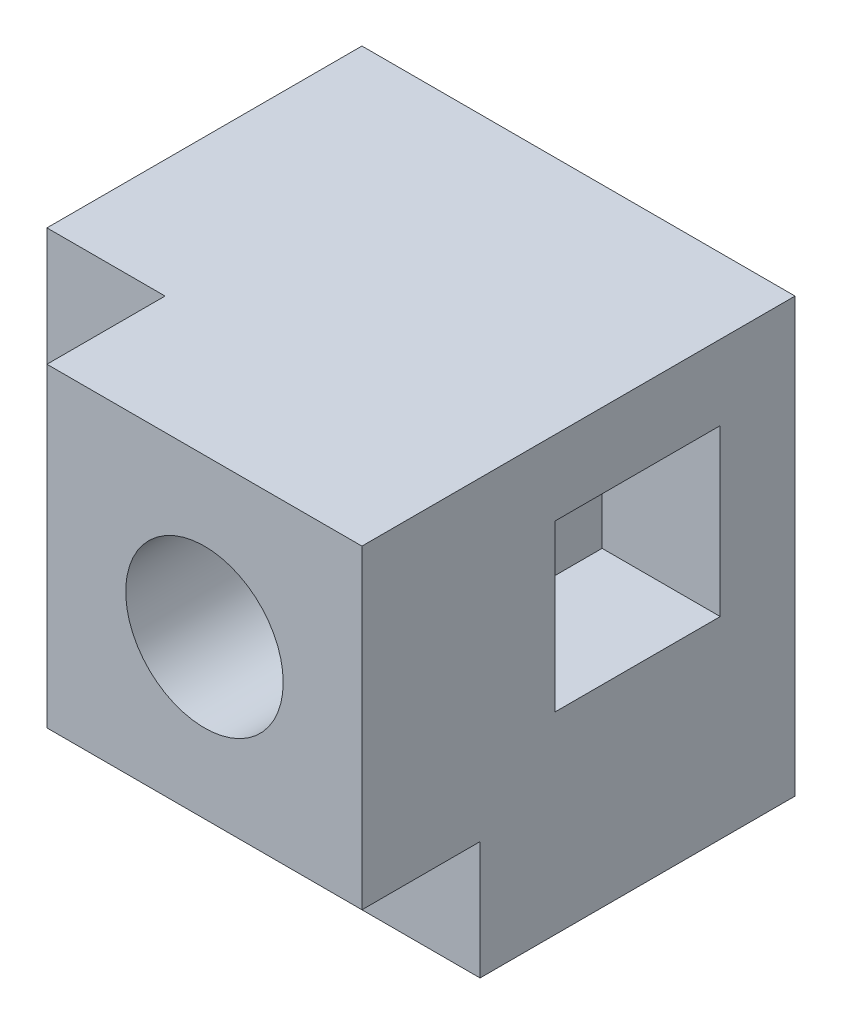
ISO-10303-21;
HEADER;
FILE_DESCRIPTION(('STEP AP214'),'2;1');
FILE_NAME('part.step','',(''),(''),'','','');
FILE_SCHEMA(('AUTOMOTIVE_DESIGN { 1 0 10303 214 1 1 1 1 }'));
ENDSEC;
DATA;
#1=APPLICATION_CONTEXT('core data for automotive mechanical design processes');
#2=APPLICATION_PROTOCOL_DEFINITION('international standard','automotive_design',2000,#1);
#3=PRODUCT_CONTEXT('',#1,'mechanical');
#4=PRODUCT('Part','Part','',(#3));
#5=PRODUCT_RELATED_PRODUCT_CATEGORY('part','',(#4));
#6=PRODUCT_DEFINITION_FORMATION('','',#4);
#7=PRODUCT_DEFINITION_CONTEXT('part definition',#1,'design');
#8=PRODUCT_DEFINITION('design','',#6,#7);
#9=PRODUCT_DEFINITION_SHAPE('','',#8);
#10=(LENGTH_UNIT() NAMED_UNIT(*) SI_UNIT(.MILLI.,.METRE.));
#11=(NAMED_UNIT(*) PLANE_ANGLE_UNIT() SI_UNIT($,.RADIAN.));
#12=(NAMED_UNIT(*) SI_UNIT($,.STERADIAN.) SOLID_ANGLE_UNIT());
#13=UNCERTAINTY_MEASURE_WITH_UNIT(LENGTH_MEASURE(1.E-05),#10,'distance_accuracy_value','');
#14=(GEOMETRIC_REPRESENTATION_CONTEXT(3) GLOBAL_UNCERTAINTY_ASSIGNED_CONTEXT((#13)) GLOBAL_UNIT_ASSIGNED_CONTEXT((#10,
#11,#12)) REPRESENTATION_CONTEXT('',''));
#15=CARTESIAN_POINT('',(0.,0.,0.));
#16=DIRECTION('',(0.,0.,1.));
#17=DIRECTION('',(1.,0.,0.));
#18=AXIS2_PLACEMENT_3D('',#15,#16,#17);
#19=CARTESIAN_POINT('',(0.,0.,0.));
#20=DIRECTION('',(0.,1.,0.));
#21=DIRECTION('',(0.,0.,1.));
#22=AXIS2_PLACEMENT_3D('',#19,#20,#21);
#23=PLANE('',#22);
#24=DIRECTION('',(0.,0.,-1.));
#25=VECTOR('',#24,1.);
#26=CARTESIAN_POINT('',(-40.,0.,40.));
#27=LINE('',#26,#25);
#28=CARTESIAN_POINT('',(-40.,0.,40.));
#29=VERTEX_POINT('',#28);
#30=CARTESIAN_POINT('',(-40.,0.,-40.));
#31=VERTEX_POINT('',#30);
#32=EDGE_CURVE('E181',#29,#31,#27,.T.);
#33=ORIENTED_EDGE('',*,*,#32,.F.);
#34=DIRECTION('',(1.,0.,0.));
#35=VECTOR('',#34,1.);
#36=CARTESIAN_POINT('',(-40.,0.,40.));
#37=LINE('',#36,#35);
#38=CARTESIAN_POINT('',(-70.,0.,40.));
#39=VERTEX_POINT('',#38);
#40=EDGE_CURVE('E242',#39,#29,#37,.T.);
#41=ORIENTED_EDGE('',*,*,#40,.F.);
#42=DIRECTION('',(0.,0.,1.));
#43=VECTOR('',#42,1.);
#44=CARTESIAN_POINT('',(-70.,0.,-40.));
#45=LINE('',#44,#43);
#46=CARTESIAN_POINT('',(-70.,0.,-40.));
#47=VERTEX_POINT('',#46);
#48=EDGE_CURVE('E228',#47,#39,#45,.T.);
#49=ORIENTED_EDGE('',*,*,#48,.F.);
#50=DIRECTION('',(-1.,0.,0.));
#51=VECTOR('',#50,1.);
#52=CARTESIAN_POINT('',(-40.,0.,-40.));
#53=LINE('',#52,#51);
#54=EDGE_CURVE('E58',#31,#47,#53,.T.);
#55=ORIENTED_EDGE('',*,*,#54,.F.);
#56=EDGE_LOOP('',(#33,#41,#49,#55));
#57=FACE_BOUND('',#56,.T.);
#58=ADVANCED_FACE('F35',(#57),#23,.F.);
#59=DIRECTION('',(-1.,0.,0.));
#60=VECTOR('',#59,1.);
#61=CARTESIAN_POINT('',(-40.,0.,40.));
#62=LINE('',#61,#60);
#63=CARTESIAN_POINT('',(40.,0.,40.));
#64=VERTEX_POINT('',#63);
#65=EDGE_CURVE('E188',#64,#29,#62,.T.);
#66=ORIENTED_EDGE('',*,*,#65,.F.);
#67=DIRECTION('',(0.,0.,-1.));
#68=VECTOR('',#67,1.);
#69=CARTESIAN_POINT('',(40.,0.,-40.));
#70=LINE('',#69,#68);
#71=CARTESIAN_POINT('',(40.,0.,70.));
#72=VERTEX_POINT('',#71);
#73=EDGE_CURVE('E237',#72,#64,#70,.T.);
#74=ORIENTED_EDGE('',*,*,#73,.F.);
#75=DIRECTION('',(1.,0.,0.));
#76=VECTOR('',#75,1.);
#77=CARTESIAN_POINT('',(40.,0.,70.));
#78=LINE('',#77,#76);
#79=CARTESIAN_POINT('',(-40.,0.,70.));
#80=VERTEX_POINT('',#79);
#81=EDGE_CURVE('E215',#80,#72,#78,.T.);
#82=ORIENTED_EDGE('',*,*,#81,.F.);
#83=DIRECTION('',(0.,0.,-1.));
#84=VECTOR('',#83,1.);
#85=CARTESIAN_POINT('',(-40.,0.,70.));
#86=LINE('',#85,#84);
#87=EDGE_CURVE('E218',#80,#29,#86,.T.);
#88=ORIENTED_EDGE('',*,*,#87,.T.);
#89=EDGE_LOOP('',(#66,#74,#82,#88));
#90=FACE_BOUND('',#89,.T.);
#91=ADVANCED_FACE('F269',(#90),#23,.F.);
#92=CARTESIAN_POINT('',(-40.,80.,40.));
#93=DIRECTION('',(0.,0.,-1.));
#94=DIRECTION('',(-1.,0.,0.));
#95=AXIS2_PLACEMENT_3D('',#92,#93,#94);
#96=PLANE('',#95);
#97=DIRECTION('',(0.,-1.,0.));
#98=VECTOR('',#97,1.);
#99=CARTESIAN_POINT('',(-40.,80.,40.));
#100=LINE('',#99,#98);
#101=CARTESIAN_POINT('',(-40.,80.,40.));
#102=VERTEX_POINT('',#101);
#103=EDGE_CURVE('E207',#102,#29,#100,.T.);
#104=ORIENTED_EDGE('',*,*,#103,.F.);
#105=DIRECTION('',(1.,0.,0.));
#106=VECTOR('',#105,1.);
#107=CARTESIAN_POINT('',(-40.,80.,40.));
#108=LINE('',#107,#106);
#109=CARTESIAN_POINT('',(-70.,80.,40.));
#110=VERTEX_POINT('',#109);
#111=EDGE_CURVE('E43',#110,#102,#108,.T.);
#112=ORIENTED_EDGE('',*,*,#111,.F.);
#113=DIRECTION('',(0.,1.,0.));
#114=VECTOR('',#113,1.);
#115=CARTESIAN_POINT('',(-70.,80.,40.));
#116=LINE('',#115,#114);
#117=EDGE_CURVE('E231',#39,#110,#116,.T.);
#118=ORIENTED_EDGE('',*,*,#117,.F.);
#119=ORIENTED_EDGE('',*,*,#40,.T.);
#120=EDGE_LOOP('',(#104,#112,#118,#119));
#121=FACE_BOUND('',#120,.T.);
#122=ADVANCED_FACE('F251',(#121),#96,.F.);
#123=CARTESIAN_POINT('',(40.,80.,-40.));
#124=DIRECTION('',(-1.,0.,0.));
#125=DIRECTION('',(0.,0.,1.));
#126=AXIS2_PLACEMENT_3D('',#123,#124,#125);
#127=PLANE('',#126);
#128=DIRECTION('',(0.,0.,-1.));
#129=VECTOR('',#128,1.);
#130=CARTESIAN_POINT('',(40.,19.,-21.));
#131=LINE('',#130,#129);
#132=CARTESIAN_POINT('',(40.,19.,21.));
#133=VERTEX_POINT('',#132);
#134=CARTESIAN_POINT('',(40.,19.,-21.));
#135=VERTEX_POINT('',#134);
#136=EDGE_CURVE('E156',#133,#135,#131,.T.);
#137=ORIENTED_EDGE('',*,*,#136,.F.);
#138=DIRECTION('',(0.,-1.,0.));
#139=VECTOR('',#138,1.);
#140=CARTESIAN_POINT('',(40.,19.,21.));
#141=LINE('',#140,#139);
#142=CARTESIAN_POINT('',(40.,61.,21.));
#143=VERTEX_POINT('',#142);
#144=EDGE_CURVE('E50',#143,#133,#141,.T.);
#145=ORIENTED_EDGE('',*,*,#144,.F.);
#146=DIRECTION('',(0.,0.,1.));
#147=VECTOR('',#146,1.);
#148=CARTESIAN_POINT('',(40.,61.,-21.));
#149=LINE('',#148,#147);
#150=CARTESIAN_POINT('',(40.,61.,-21.));
#151=VERTEX_POINT('',#150);
#152=EDGE_CURVE('E147',#151,#143,#149,.T.);
#153=ORIENTED_EDGE('',*,*,#152,.F.);
#154=DIRECTION('',(0.,1.,0.));
#155=VECTOR('',#154,1.);
#156=CARTESIAN_POINT('',(40.,19.,-21.));
#157=LINE('',#156,#155);
#158=EDGE_CURVE('E150',#135,#151,#157,.T.);
#159=ORIENTED_EDGE('',*,*,#158,.F.);
#160=EDGE_LOOP('',(#137,#145,#153,#159));
#161=FACE_BOUND('',#160,.T.);
#162=ORIENTED_EDGE('',*,*,#73,.T.);
#163=DIRECTION('',(0.,1.,0.));
#164=VECTOR('',#163,1.);
#165=CARTESIAN_POINT('',(40.,-30.,40.));
#166=LINE('',#165,#164);
#167=CARTESIAN_POINT('',(40.,-30.,40.));
#168=VERTEX_POINT('',#167);
#169=EDGE_CURVE('E202',#168,#64,#166,.T.);
#170=ORIENTED_EDGE('',*,*,#169,.F.);
#171=DIRECTION('',(0.,0.,1.));
#172=VECTOR('',#171,1.);
#173=CARTESIAN_POINT('',(40.,-30.,40.));
#174=LINE('',#173,#172);
#175=CARTESIAN_POINT('',(40.,-30.,-40.));
#176=VERTEX_POINT('',#175);
#177=EDGE_CURVE('E191',#176,#168,#174,.T.);
#178=ORIENTED_EDGE('',*,*,#177,.F.);
#179=DIRECTION('',(0.,-1.,0.));
#180=VECTOR('',#179,1.);
#181=CARTESIAN_POINT('',(40.,80.,-40.));
#182=LINE('',#181,#180);
#183=CARTESIAN_POINT('',(40.,80.,-40.));
#184=VERTEX_POINT('',#183);
#185=EDGE_CURVE('E11',#184,#176,#182,.T.);
#186=ORIENTED_EDGE('',*,*,#185,.F.);
#187=DIRECTION('',(0.,0.,-1.));
#188=VECTOR('',#187,1.);
#189=CARTESIAN_POINT('',(40.,80.,-40.));
#190=LINE('',#189,#188);
#191=CARTESIAN_POINT('',(40.,80.,70.));
#192=VERTEX_POINT('',#191);
#193=EDGE_CURVE('E238',#192,#184,#190,.T.);
#194=ORIENTED_EDGE('',*,*,#193,.F.);
#195=DIRECTION('',(0.,1.,0.));
#196=VECTOR('',#195,1.);
#197=CARTESIAN_POINT('',(40.,80.,70.));
#198=LINE('',#197,#196);
#199=EDGE_CURVE('E208',#72,#192,#198,.T.);
#200=ORIENTED_EDGE('',*,*,#199,.F.);
#201=EDGE_LOOP('',(#162,#170,#178,#186,#194,#200));
#202=FACE_BOUND('',#201,.T.);
#203=ADVANCED_FACE('F37',(#161,#202),#127,.F.);
#204=CARTESIAN_POINT('',(-40.,80.,-40.));
#205=DIRECTION('',(0.,0.,1.));
#206=DIRECTION('',(1.,0.,0.));
#207=AXIS2_PLACEMENT_3D('',#204,#205,#206);
#208=PLANE('',#207);
#209=ORIENTED_EDGE('',*,*,#185,.T.);
#210=DIRECTION('',(1.,0.,0.));
#211=VECTOR('',#210,1.);
#212=CARTESIAN_POINT('',(-40.,-30.,-40.));
#213=LINE('',#212,#211);
#214=CARTESIAN_POINT('',(-40.,-30.,-40.));
#215=VERTEX_POINT('',#214);
#216=EDGE_CURVE('E187',#215,#176,#213,.T.);
#217=ORIENTED_EDGE('',*,*,#216,.F.);
#218=DIRECTION('',(0.,1.,0.));
#219=VECTOR('',#218,1.);
#220=CARTESIAN_POINT('',(-40.,-30.,-40.));
#221=LINE('',#220,#219);
#222=EDGE_CURVE('E205',#215,#31,#221,.T.);
#223=ORIENTED_EDGE('',*,*,#222,.T.);
#224=ORIENTED_EDGE('',*,*,#54,.T.);
#225=DIRECTION('',(0.,-1.,0.));
#226=VECTOR('',#225,1.);
#227=CARTESIAN_POINT('',(-70.,80.,-40.));
#228=LINE('',#227,#226);
#229=CARTESIAN_POINT('',(-70.,80.,-40.));
#230=VERTEX_POINT('',#229);
#231=EDGE_CURVE('E225',#230,#47,#228,.T.);
#232=ORIENTED_EDGE('',*,*,#231,.F.);
#233=DIRECTION('',(-1.,0.,0.));
#234=VECTOR('',#233,1.);
#235=CARTESIAN_POINT('',(-40.,80.,-40.));
#236=LINE('',#235,#234);
#237=EDGE_CURVE('E241',#184,#230,#236,.T.);
#238=ORIENTED_EDGE('',*,*,#237,.F.);
#239=EDGE_LOOP('',(#209,#217,#223,#224,#232,#238));
#240=FACE_BOUND('',#239,.T.);
#241=ADVANCED_FACE('F285',(#240),#208,.F.);
#242=CARTESIAN_POINT('',(0.,80.,0.));
#243=DIRECTION('',(0.,1.,0.));
#244=DIRECTION('',(0.,0.,1.));
#245=AXIS2_PLACEMENT_3D('',#242,#243,#244);
#246=PLANE('',#245);
#247=ORIENTED_EDGE('',*,*,#193,.T.);
#248=ORIENTED_EDGE('',*,*,#237,.T.);
#249=DIRECTION('',(0.,0.,-1.));
#250=VECTOR('',#249,1.);
#251=CARTESIAN_POINT('',(-70.,80.,-40.));
#252=LINE('',#251,#250);
#253=EDGE_CURVE('E234',#110,#230,#252,.T.);
#254=ORIENTED_EDGE('',*,*,#253,.F.);
#255=ORIENTED_EDGE('',*,*,#111,.T.);
#256=DIRECTION('',(0.,0.,-1.));
#257=VECTOR('',#256,1.);
#258=CARTESIAN_POINT('',(-40.,80.,70.));
#259=LINE('',#258,#257);
#260=CARTESIAN_POINT('',(-40.,80.,70.));
#261=VERTEX_POINT('',#260);
#262=EDGE_CURVE('E222',#261,#102,#259,.T.);
#263=ORIENTED_EDGE('',*,*,#262,.F.);
#264=DIRECTION('',(-1.,0.,0.));
#265=VECTOR('',#264,1.);
#266=CARTESIAN_POINT('',(40.,80.,70.));
#267=LINE('',#266,#265);
#268=EDGE_CURVE('E211',#192,#261,#267,.T.);
#269=ORIENTED_EDGE('',*,*,#268,.F.);
#270=EDGE_LOOP('',(#247,#248,#254,#255,#263,#269));
#271=FACE_BOUND('',#270,.T.);
#272=ADVANCED_FACE('F279',(#271),#246,.T.);
#273=CARTESIAN_POINT('',(-70.,0.,0.));
#274=DIRECTION('',(-1.,0.,0.));
#275=DIRECTION('',(0.,0.,1.));
#276=AXIS2_PLACEMENT_3D('',#273,#274,#275);
#277=PLANE('',#276);
#278=CARTESIAN_POINT('',(-70.,40.,0.));
#279=DIRECTION('',(-1.,0.,0.));
#280=DIRECTION('',(0.,0.,1.));
#281=AXIS2_PLACEMENT_3D('',#278,#279,#280);
#282=CIRCLE('',#281,20.);
#283=CARTESIAN_POINT('',(-70.,40.,20.));
#284=VERTEX_POINT('',#283);
#285=EDGE_CURVE('E175',#284,#284,#282,.T.);
#286=ORIENTED_EDGE('',*,*,#285,.F.);
#287=EDGE_LOOP('',(#286));
#288=FACE_BOUND('',#287,.T.);
#289=ORIENTED_EDGE('',*,*,#231,.T.);
#290=ORIENTED_EDGE('',*,*,#48,.T.);
#291=ORIENTED_EDGE('',*,*,#117,.T.);
#292=ORIENTED_EDGE('',*,*,#253,.T.);
#293=EDGE_LOOP('',(#289,#290,#291,#292));
#294=FACE_BOUND('',#293,.T.);
#295=ADVANCED_FACE('F282',(#288,#294),#277,.T.);
#296=CARTESIAN_POINT('',(-40.,80.,70.));
#297=DIRECTION('',(1.,0.,0.));
#298=DIRECTION('',(0.,0.,-1.));
#299=AXIS2_PLACEMENT_3D('',#296,#297,#298);
#300=PLANE('',#299);
#301=ORIENTED_EDGE('',*,*,#103,.T.);
#302=ORIENTED_EDGE('',*,*,#87,.F.);
#303=DIRECTION('',(0.,-1.,0.));
#304=VECTOR('',#303,1.);
#305=CARTESIAN_POINT('',(-40.,80.,70.));
#306=LINE('',#305,#304);
#307=EDGE_CURVE('E213',#261,#80,#306,.T.);
#308=ORIENTED_EDGE('',*,*,#307,.F.);
#309=ORIENTED_EDGE('',*,*,#262,.T.);
#310=EDGE_LOOP('',(#301,#302,#308,#309));
#311=FACE_BOUND('',#310,.T.);
#312=ADVANCED_FACE('F277',(#311),#300,.F.);
#313=CARTESIAN_POINT('',(0.,0.,70.));
#314=DIRECTION('',(0.,0.,-1.));
#315=DIRECTION('',(-1.,0.,0.));
#316=AXIS2_PLACEMENT_3D('',#313,#314,#315);
#317=PLANE('',#316);
#318=CARTESIAN_POINT('',(0.,40.,70.));
#319=DIRECTION('',(0.,0.,1.));
#320=DIRECTION('',(1.,0.,0.));
#321=AXIS2_PLACEMENT_3D('',#318,#319,#320);
#322=CIRCLE('',#321,20.);
#323=CARTESIAN_POINT('',(20.,40.,70.));
#324=VERTEX_POINT('',#323);
#325=EDGE_CURVE('E169',#324,#324,#322,.T.);
#326=ORIENTED_EDGE('',*,*,#325,.F.);
#327=EDGE_LOOP('',(#326));
#328=FACE_BOUND('',#327,.T.);
#329=ORIENTED_EDGE('',*,*,#199,.T.);
#330=ORIENTED_EDGE('',*,*,#268,.T.);
#331=ORIENTED_EDGE('',*,*,#307,.T.);
#332=ORIENTED_EDGE('',*,*,#81,.T.);
#333=EDGE_LOOP('',(#329,#330,#331,#332));
#334=FACE_BOUND('',#333,.T.);
#335=ADVANCED_FACE('F271',(#328,#334),#317,.F.);
#336=CARTESIAN_POINT('',(-40.,-30.,40.));
#337=DIRECTION('',(1.,0.,0.));
#338=DIRECTION('',(0.,0.,-1.));
#339=AXIS2_PLACEMENT_3D('',#336,#337,#338);
#340=PLANE('',#339);
#341=ORIENTED_EDGE('',*,*,#32,.T.);
#342=ORIENTED_EDGE('',*,*,#222,.F.);
#343=DIRECTION('',(0.,0.,-1.));
#344=VECTOR('',#343,1.);
#345=CARTESIAN_POINT('',(-40.,-30.,40.));
#346=LINE('',#345,#344);
#347=CARTESIAN_POINT('',(-40.,-30.,40.));
#348=VERTEX_POINT('',#347);
#349=EDGE_CURVE('E184',#348,#215,#346,.T.);
#350=ORIENTED_EDGE('',*,*,#349,.F.);
#351=DIRECTION('',(0.,1.,0.));
#352=VECTOR('',#351,1.);
#353=CARTESIAN_POINT('',(-40.,-30.,40.));
#354=LINE('',#353,#352);
#355=EDGE_CURVE('E195',#348,#29,#354,.T.);
#356=ORIENTED_EDGE('',*,*,#355,.T.);
#357=EDGE_LOOP('',(#341,#342,#350,#356));
#358=FACE_BOUND('',#357,.T.);
#359=ADVANCED_FACE('F261',(#358),#340,.F.);
#360=CARTESIAN_POINT('',(-40.,-30.,40.));
#361=DIRECTION('',(0.,0.,-1.));
#362=DIRECTION('',(-1.,0.,0.));
#363=AXIS2_PLACEMENT_3D('',#360,#361,#362);
#364=PLANE('',#363);
#365=ORIENTED_EDGE('',*,*,#65,.T.);
#366=ORIENTED_EDGE('',*,*,#355,.F.);
#367=DIRECTION('',(-1.,0.,0.));
#368=VECTOR('',#367,1.);
#369=CARTESIAN_POINT('',(-40.,-30.,40.));
#370=LINE('',#369,#368);
#371=EDGE_CURVE('E193',#168,#348,#370,.T.);
#372=ORIENTED_EDGE('',*,*,#371,.F.);
#373=ORIENTED_EDGE('',*,*,#169,.T.);
#374=EDGE_LOOP('',(#365,#366,#372,#373));
#375=FACE_BOUND('',#374,.T.);
#376=ADVANCED_FACE('F256',(#375),#364,.F.);
#377=CARTESIAN_POINT('',(0.,-30.,0.));
#378=DIRECTION('',(0.,-1.,0.));
#379=DIRECTION('',(0.,0.,-1.));
#380=AXIS2_PLACEMENT_3D('',#377,#378,#379);
#381=PLANE('',#380);
#382=CARTESIAN_POINT('',(0.,-30.,0.));
#383=DIRECTION('',(0.,-1.,0.));
#384=DIRECTION('',(0.,0.,-1.));
#385=AXIS2_PLACEMENT_3D('',#382,#383,#384);
#386=CIRCLE('',#385,20.);
#387=CARTESIAN_POINT('',(0.,-30.,-20.));
#388=VERTEX_POINT('',#387);
#389=EDGE_CURVE('E162',#388,#388,#386,.T.);
#390=ORIENTED_EDGE('',*,*,#389,.F.);
#391=EDGE_LOOP('',(#390));
#392=FACE_BOUND('',#391,.T.);
#393=ORIENTED_EDGE('',*,*,#349,.T.);
#394=ORIENTED_EDGE('',*,*,#216,.T.);
#395=ORIENTED_EDGE('',*,*,#177,.T.);
#396=ORIENTED_EDGE('',*,*,#371,.T.);
#397=EDGE_LOOP('',(#393,#394,#395,#396));
#398=FACE_BOUND('',#397,.T.);
#399=ADVANCED_FACE('F263',(#392,#398),#381,.T.);
#400=CARTESIAN_POINT('',(-25.,40.,0.));
#401=DIRECTION('',(-1.,0.,0.));
#402=DIRECTION('',(0.,0.,1.));
#403=AXIS2_PLACEMENT_3D('',#400,#401,#402);
#404=CYLINDRICAL_SURFACE('',#403,20.);
#405=CARTESIAN_POINT('',(-25.,40.,0.));
#406=DIRECTION('',(-1.,0.,0.));
#407=DIRECTION('',(0.,0.,1.));
#408=AXIS2_PLACEMENT_3D('',#405,#406,#407);
#409=CIRCLE('',#408,20.);
#410=CARTESIAN_POINT('',(-25.,40.,20.));
#411=VERTEX_POINT('',#410);
#412=EDGE_CURVE('E178',#411,#411,#409,.T.);
#413=CARTESIAN_POINT('',(-25.,40.,20.));
#414=CARTESIAN_POINT('',(-25.46875,40.,20.));
#415=CARTESIAN_POINT('',(-25.9375,40.,20.));
#416=CARTESIAN_POINT('',(-26.875,40.,20.));
#417=CARTESIAN_POINT('',(-27.34375,40.,20.));
#418=CARTESIAN_POINT('',(-28.28125,40.,20.));
#419=CARTESIAN_POINT('',(-28.75,40.,20.));
#420=CARTESIAN_POINT('',(-29.6875,40.,20.));
#421=CARTESIAN_POINT('',(-30.15625,40.,20.));
#422=CARTESIAN_POINT('',(-31.09375,40.,20.));
#423=CARTESIAN_POINT('',(-31.5625,40.,20.));
#424=CARTESIAN_POINT('',(-32.5,40.,20.));
#425=CARTESIAN_POINT('',(-32.96875,40.,20.));
#426=CARTESIAN_POINT('',(-33.90625,40.,20.));
#427=CARTESIAN_POINT('',(-34.375,40.,20.));
#428=CARTESIAN_POINT('',(-35.3125,40.,20.));
#429=CARTESIAN_POINT('',(-35.78125,40.,20.));
#430=CARTESIAN_POINT('',(-36.71875,40.,20.));
#431=CARTESIAN_POINT('',(-37.1875,40.,20.));
#432=CARTESIAN_POINT('',(-38.125,40.,20.));
#433=CARTESIAN_POINT('',(-38.59375,40.,20.));
#434=CARTESIAN_POINT('',(-39.53125,40.,20.));
#435=CARTESIAN_POINT('',(-40.,40.,20.));
#436=CARTESIAN_POINT('',(-40.9375,40.,20.));
#437=CARTESIAN_POINT('',(-41.40625,40.,20.));
#438=CARTESIAN_POINT('',(-42.34375,40.,20.));
#439=CARTESIAN_POINT('',(-42.8125,40.,20.));
#440=CARTESIAN_POINT('',(-43.75,40.,20.));
#441=CARTESIAN_POINT('',(-44.21875,40.,20.));
#442=CARTESIAN_POINT('',(-45.15625,40.,20.));
#443=CARTESIAN_POINT('',(-45.625,40.,20.));
#444=CARTESIAN_POINT('',(-46.5625,40.,20.));
#445=CARTESIAN_POINT('',(-47.03125,40.,20.));
#446=CARTESIAN_POINT('',(-47.96875,40.,20.));
#447=CARTESIAN_POINT('',(-48.4375,40.,20.));
#448=CARTESIAN_POINT('',(-49.375,40.,20.));
#449=CARTESIAN_POINT('',(-49.84375,40.,20.));
#450=CARTESIAN_POINT('',(-50.78125,40.,20.));
#451=CARTESIAN_POINT('',(-51.25,40.,20.));
#452=CARTESIAN_POINT('',(-52.1875,40.,20.));
#453=CARTESIAN_POINT('',(-52.65625,40.,20.));
#454=CARTESIAN_POINT('',(-53.59375,40.,20.));
#455=CARTESIAN_POINT('',(-54.0625,40.,20.));
#456=CARTESIAN_POINT('',(-55.,40.,20.));
#457=CARTESIAN_POINT('',(-55.46875,40.,20.));
#458=CARTESIAN_POINT('',(-56.40625,40.,20.));
#459=CARTESIAN_POINT('',(-56.875,40.,20.));
#460=CARTESIAN_POINT('',(-57.8125,40.,20.));
#461=CARTESIAN_POINT('',(-58.28125,40.,20.));
#462=CARTESIAN_POINT('',(-59.21875,40.,20.));
#463=CARTESIAN_POINT('',(-59.6875,40.,20.));
#464=CARTESIAN_POINT('',(-60.625,40.,20.));
#465=CARTESIAN_POINT('',(-61.09375,40.,20.));
#466=CARTESIAN_POINT('',(-62.03125,40.,20.));
#467=CARTESIAN_POINT('',(-62.5,40.,20.));
#468=CARTESIAN_POINT('',(-63.4375,40.,20.));
#469=CARTESIAN_POINT('',(-63.90625,40.,20.));
#470=CARTESIAN_POINT('',(-64.84375,40.,20.));
#471=CARTESIAN_POINT('',(-65.3125,40.,20.));
#472=CARTESIAN_POINT('',(-66.25,40.,20.));
#473=CARTESIAN_POINT('',(-66.71875,40.,20.));
#474=CARTESIAN_POINT('',(-67.65625,40.,20.));
#475=CARTESIAN_POINT('',(-68.125,40.,20.));
#476=CARTESIAN_POINT('',(-69.0625,40.,20.));
#477=CARTESIAN_POINT('',(-69.53125,40.,20.));
#478=CARTESIAN_POINT('',(-70.,40.,20.));
#479=B_SPLINE_CURVE_WITH_KNOTS('',3,(#413,#414,#415,#416,#417,#418,#419,#420,#421,#422,#423,
#424,#425,#426,#427,#428,#429,#430,#431,#432,#433,#434,#435,#436,#437,#438,#439,#440,#441,#442,
#443,#444,#445,#446,#447,#448,#449,#450,#451,#452,#453,#454,#455,#456,#457,#458,#459,#460,#461,
#462,#463,#464,#465,#466,#467,#468,#469,#470,#471,#472,#473,#474,#475,#476,#477,#478),
.UNSPECIFIED.,.F.,.F.,(4,2,2,2,2,2,2,2,2,2,2,2,2,2,2,2,2,2,2,2,2,2,2,2,2,2,2,2,2,2,2,2,4),(0.,
1.40625,2.8125,4.21875,5.625,7.03125,8.4375,9.84375,11.25,12.65625,14.0625,15.46875,16.875,
18.28125,19.6875,21.09375,22.5,23.90625,25.3125,26.71875,28.125,29.53125,30.9375,32.34375,33.75,
35.15625,36.5625,37.96875,39.375,40.78125,42.1875,43.59375,45.),.UNSPECIFIED.);
#480=EDGE_CURVE('BSEAM392',#411,#284,#479,.T.);
#481=ORIENTED_EDGE('',*,*,#412,.F.);
#482=ORIENTED_EDGE('',*,*,#285,.T.);
#483=ORIENTED_EDGE('',*,*,#480,.T.);
#484=ORIENTED_EDGE('',*,*,#480,.F.);
#485=EDGE_LOOP('',(#481,#483,#482,#484));
#486=FACE_BOUND('',#485,.T.);
#487=ADVANCED_FACE('F392',(#486),#404,.F.);
#488=CARTESIAN_POINT('',(-25.,40.,0.));
#489=DIRECTION('',(-1.,0.,0.));
#490=DIRECTION('',(0.,0.,1.));
#491=AXIS2_PLACEMENT_3D('',#488,#489,#490);
#492=PLANE('',#491);
#493=ORIENTED_EDGE('',*,*,#412,.T.);
#494=EDGE_LOOP('',(#493));
#495=FACE_BOUND('',#494,.T.);
#496=ADVANCED_FACE('F404',(#495),#492,.T.);
#497=CARTESIAN_POINT('',(0.,40.,25.));
#498=DIRECTION('',(0.,0.,1.));
#499=DIRECTION('',(1.,0.,0.));
#500=AXIS2_PLACEMENT_3D('',#497,#498,#499);
#501=CYLINDRICAL_SURFACE('',#500,20.);
#502=CARTESIAN_POINT('',(0.,40.,25.));
#503=DIRECTION('',(0.,0.,1.));
#504=DIRECTION('',(1.,0.,0.));
#505=AXIS2_PLACEMENT_3D('',#502,#503,#504);
#506=CIRCLE('',#505,20.);
#507=CARTESIAN_POINT('',(20.,40.,25.));
#508=VERTEX_POINT('',#507);
#509=EDGE_CURVE('E172',#508,#508,#506,.T.);
#510=CARTESIAN_POINT('',(20.,40.,25.));
#511=CARTESIAN_POINT('',(20.,40.,25.46875));
#512=CARTESIAN_POINT('',(20.,40.,25.9375));
#513=CARTESIAN_POINT('',(20.,40.,26.875));
#514=CARTESIAN_POINT('',(20.,40.,27.34375));
#515=CARTESIAN_POINT('',(20.,40.,28.28125));
#516=CARTESIAN_POINT('',(20.,40.,28.75));
#517=CARTESIAN_POINT('',(20.,40.,29.6875));
#518=CARTESIAN_POINT('',(20.,40.,30.15625));
#519=CARTESIAN_POINT('',(20.,40.,31.09375));
#520=CARTESIAN_POINT('',(20.,40.,31.5625));
#521=CARTESIAN_POINT('',(20.,40.,32.5));
#522=CARTESIAN_POINT('',(20.,40.,32.96875));
#523=CARTESIAN_POINT('',(20.,40.,33.90625));
#524=CARTESIAN_POINT('',(20.,40.,34.375));
#525=CARTESIAN_POINT('',(20.,40.,35.3125));
#526=CARTESIAN_POINT('',(20.,40.,35.78125));
#527=CARTESIAN_POINT('',(20.,40.,36.71875));
#528=CARTESIAN_POINT('',(20.,40.,37.1875));
#529=CARTESIAN_POINT('',(20.,40.,38.125));
#530=CARTESIAN_POINT('',(20.,40.,38.59375));
#531=CARTESIAN_POINT('',(20.,40.,39.53125));
#532=CARTESIAN_POINT('',(20.,40.,40.));
#533=CARTESIAN_POINT('',(20.,40.,40.9375));
#534=CARTESIAN_POINT('',(20.,40.,41.40625));
#535=CARTESIAN_POINT('',(20.,40.,42.34375));
#536=CARTESIAN_POINT('',(20.,40.,42.8125));
#537=CARTESIAN_POINT('',(20.,40.,43.75));
#538=CARTESIAN_POINT('',(20.,40.,44.21875));
#539=CARTESIAN_POINT('',(20.,40.,45.15625));
#540=CARTESIAN_POINT('',(20.,40.,45.625));
#541=CARTESIAN_POINT('',(20.,40.,46.5625));
#542=CARTESIAN_POINT('',(20.,40.,47.03125));
#543=CARTESIAN_POINT('',(20.,40.,47.96875));
#544=CARTESIAN_POINT('',(20.,40.,48.4375));
#545=CARTESIAN_POINT('',(20.,40.,49.375));
#546=CARTESIAN_POINT('',(20.,40.,49.84375));
#547=CARTESIAN_POINT('',(20.,40.,50.78125));
#548=CARTESIAN_POINT('',(20.,40.,51.25));
#549=CARTESIAN_POINT('',(20.,40.,52.1875));
#550=CARTESIAN_POINT('',(20.,40.,52.65625));
#551=CARTESIAN_POINT('',(20.,40.,53.59375));
#552=CARTESIAN_POINT('',(20.,40.,54.0625));
#553=CARTESIAN_POINT('',(20.,40.,55.));
#554=CARTESIAN_POINT('',(20.,40.,55.46875));
#555=CARTESIAN_POINT('',(20.,40.,56.40625));
#556=CARTESIAN_POINT('',(20.,40.,56.875));
#557=CARTESIAN_POINT('',(20.,40.,57.8125));
#558=CARTESIAN_POINT('',(20.,40.,58.28125));
#559=CARTESIAN_POINT('',(20.,40.,59.21875));
#560=CARTESIAN_POINT('',(20.,40.,59.6875));
#561=CARTESIAN_POINT('',(20.,40.,60.625));
#562=CARTESIAN_POINT('',(20.,40.,61.09375));
#563=CARTESIAN_POINT('',(20.,40.,62.03125));
#564=CARTESIAN_POINT('',(20.,40.,62.5));
#565=CARTESIAN_POINT('',(20.,40.,63.4375));
#566=CARTESIAN_POINT('',(20.,40.,63.90625));
#567=CARTESIAN_POINT('',(20.,40.,64.84375));
#568=CARTESIAN_POINT('',(20.,40.,65.3125));
#569=CARTESIAN_POINT('',(20.,40.,66.25));
#570=CARTESIAN_POINT('',(20.,40.,66.71875));
#571=CARTESIAN_POINT('',(20.,40.,67.65625));
#572=CARTESIAN_POINT('',(20.,40.,68.125));
#573=CARTESIAN_POINT('',(20.,40.,69.0625));
#574=CARTESIAN_POINT('',(20.,40.,69.53125));
#575=CARTESIAN_POINT('',(20.,40.,70.));
#576=B_SPLINE_CURVE_WITH_KNOTS('',3,(#510,#511,#512,#513,#514,#515,#516,#517,#518,#519,#520,
#521,#522,#523,#524,#525,#526,#527,#528,#529,#530,#531,#532,#533,#534,#535,#536,#537,#538,#539,
#540,#541,#542,#543,#544,#545,#546,#547,#548,#549,#550,#551,#552,#553,#554,#555,#556,#557,#558,
#559,#560,#561,#562,#563,#564,#565,#566,#567,#568,#569,#570,#571,#572,#573,#574,#575),
.UNSPECIFIED.,.F.,.F.,(4,2,2,2,2,2,2,2,2,2,2,2,2,2,2,2,2,2,2,2,2,2,2,2,2,2,2,2,2,2,2,2,4),(0.,
1.40625,2.8125,4.21875,5.625,7.03125,8.4375,9.84375,11.25,12.65625,14.0625,15.46875,16.875,
18.28125,19.6875,21.09375,22.5,23.90625,25.3125,26.71875,28.125,29.53125,30.9375,32.34375,33.75,
35.15625,36.5625,37.96875,39.375,40.78125,42.1875,43.59375,45.),.UNSPECIFIED.);
#577=EDGE_CURVE('BSEAM414',#508,#324,#576,.T.);
#578=ORIENTED_EDGE('',*,*,#509,.F.);
#579=ORIENTED_EDGE('',*,*,#325,.T.);
#580=ORIENTED_EDGE('',*,*,#577,.T.);
#581=ORIENTED_EDGE('',*,*,#577,.F.);
#582=EDGE_LOOP('',(#578,#580,#579,#581));
#583=FACE_BOUND('',#582,.T.);
#584=ADVANCED_FACE('F414',(#583),#501,.F.);
#585=CARTESIAN_POINT('',(0.,40.,25.));
#586=DIRECTION('',(0.,0.,1.));
#587=DIRECTION('',(1.,0.,0.));
#588=AXIS2_PLACEMENT_3D('',#585,#586,#587);
#589=PLANE('',#588);
#590=ORIENTED_EDGE('',*,*,#509,.T.);
#591=EDGE_LOOP('',(#590));
#592=FACE_BOUND('',#591,.T.);
#593=ADVANCED_FACE('F425',(#592),#589,.T.);
#594=CARTESIAN_POINT('',(0.,15.,0.));
#595=DIRECTION('',(0.,-1.,0.));
#596=DIRECTION('',(0.,0.,-1.));
#597=AXIS2_PLACEMENT_3D('',#594,#595,#596);
#598=CYLINDRICAL_SURFACE('',#597,20.);
#599=CARTESIAN_POINT('',(0.,15.,0.));
#600=DIRECTION('',(0.,-1.,0.));
#601=DIRECTION('',(0.,0.,-1.));
#602=AXIS2_PLACEMENT_3D('',#599,#600,#601);
#603=CIRCLE('',#602,20.);
#604=CARTESIAN_POINT('',(0.,15.,-20.));
#605=VERTEX_POINT('',#604);
#606=EDGE_CURVE('E166',#605,#605,#603,.T.);
#607=CARTESIAN_POINT('',(0.,15.,-20.));
#608=CARTESIAN_POINT('',(0.,14.53125,-20.));
#609=CARTESIAN_POINT('',(0.,14.0625,-20.));
#610=CARTESIAN_POINT('',(0.,13.125,-20.));
#611=CARTESIAN_POINT('',(0.,12.65625,-20.));
#612=CARTESIAN_POINT('',(0.,11.71875,-20.));
#613=CARTESIAN_POINT('',(0.,11.25,-20.));
#614=CARTESIAN_POINT('',(0.,10.3125,-20.));
#615=CARTESIAN_POINT('',(0.,9.84375,-20.));
#616=CARTESIAN_POINT('',(0.,8.90625,-20.));
#617=CARTESIAN_POINT('',(0.,8.4375,-20.));
#618=CARTESIAN_POINT('',(0.,7.5,-20.));
#619=CARTESIAN_POINT('',(0.,7.03125,-20.));
#620=CARTESIAN_POINT('',(0.,6.09375,-20.));
#621=CARTESIAN_POINT('',(0.,5.625,-20.));
#622=CARTESIAN_POINT('',(0.,4.6875,-20.));
#623=CARTESIAN_POINT('',(0.,4.21875,-20.));
#624=CARTESIAN_POINT('',(0.,3.28125,-20.));
#625=CARTESIAN_POINT('',(0.,2.8125,-20.));
#626=CARTESIAN_POINT('',(0.,1.875,-20.));
#627=CARTESIAN_POINT('',(0.,1.40625,-20.));
#628=CARTESIAN_POINT('',(0.,0.468750000000004,-20.));
#629=CARTESIAN_POINT('',(0.,0.,-20.));
#630=CARTESIAN_POINT('',(0.,-0.937499999999997,-20.));
#631=CARTESIAN_POINT('',(0.,-1.40625,-20.));
#632=CARTESIAN_POINT('',(0.,-2.34375,-20.));
#633=CARTESIAN_POINT('',(0.,-2.8125,-20.));
#634=CARTESIAN_POINT('',(0.,-3.75,-20.));
#635=CARTESIAN_POINT('',(0.,-4.21875,-20.));
#636=CARTESIAN_POINT('',(0.,-5.15625,-20.));
#637=CARTESIAN_POINT('',(0.,-5.625,-20.));
#638=CARTESIAN_POINT('',(0.,-6.5625,-20.));
#639=CARTESIAN_POINT('',(0.,-7.03125,-20.));
#640=CARTESIAN_POINT('',(0.,-7.96875,-20.));
#641=CARTESIAN_POINT('',(0.,-8.4375,-20.));
#642=CARTESIAN_POINT('',(0.,-9.375,-20.));
#643=CARTESIAN_POINT('',(0.,-9.84375,-20.));
#644=CARTESIAN_POINT('',(0.,-10.78125,-20.));
#645=CARTESIAN_POINT('',(0.,-11.25,-20.));
#646=CARTESIAN_POINT('',(0.,-12.1875,-20.));
#647=CARTESIAN_POINT('',(0.,-12.65625,-20.));
#648=CARTESIAN_POINT('',(0.,-13.59375,-20.));
#649=CARTESIAN_POINT('',(0.,-14.0625,-20.));
#650=CARTESIAN_POINT('',(0.,-15.,-20.));
#651=CARTESIAN_POINT('',(0.,-15.46875,-20.));
#652=CARTESIAN_POINT('',(0.,-16.40625,-20.));
#653=CARTESIAN_POINT('',(0.,-16.875,-20.));
#654=CARTESIAN_POINT('',(0.,-17.8125,-20.));
#655=CARTESIAN_POINT('',(0.,-18.28125,-20.));
#656=CARTESIAN_POINT('',(0.,-19.21875,-20.));
#657=CARTESIAN_POINT('',(0.,-19.6875,-20.));
#658=CARTESIAN_POINT('',(0.,-20.625,-20.));
#659=CARTESIAN_POINT('',(0.,-21.09375,-20.));
#660=CARTESIAN_POINT('',(0.,-22.03125,-20.));
#661=CARTESIAN_POINT('',(0.,-22.5,-20.));
#662=CARTESIAN_POINT('',(0.,-23.4375,-20.));
#663=CARTESIAN_POINT('',(0.,-23.90625,-20.));
#664=CARTESIAN_POINT('',(0.,-24.84375,-20.));
#665=CARTESIAN_POINT('',(0.,-25.3125,-20.));
#666=CARTESIAN_POINT('',(0.,-26.25,-20.));
#667=CARTESIAN_POINT('',(0.,-26.71875,-20.));
#668=CARTESIAN_POINT('',(0.,-27.65625,-20.));
#669=CARTESIAN_POINT('',(0.,-28.125,-20.));
#670=CARTESIAN_POINT('',(0.,-29.0625,-20.));
#671=CARTESIAN_POINT('',(0.,-29.53125,-20.));
#672=CARTESIAN_POINT('',(0.,-30.,-20.));
#673=B_SPLINE_CURVE_WITH_KNOTS('',3,(#607,#608,#609,#610,#611,#612,#613,#614,#615,#616,#617,
#618,#619,#620,#621,#622,#623,#624,#625,#626,#627,#628,#629,#630,#631,#632,#633,#634,#635,#636,
#637,#638,#639,#640,#641,#642,#643,#644,#645,#646,#647,#648,#649,#650,#651,#652,#653,#654,#655,
#656,#657,#658,#659,#660,#661,#662,#663,#664,#665,#666,#667,#668,#669,#670,#671,#672),
.UNSPECIFIED.,.F.,.F.,(4,2,2,2,2,2,2,2,2,2,2,2,2,2,2,2,2,2,2,2,2,2,2,2,2,2,2,2,2,2,2,2,4),(0.,
1.40625,2.8125,4.21875,5.625,7.03125,8.4375,9.84375,11.25,12.65625,14.0625,15.46875,16.875,
18.28125,19.6875,21.09375,22.5,23.90625,25.3125,26.71875,28.125,29.53125,30.9375,32.34375,33.75,
35.15625,36.5625,37.96875,39.375,40.78125,42.1875,43.59375,45.),.UNSPECIFIED.);
#674=EDGE_CURVE('BSEAM434',#605,#388,#673,.T.);
#675=ORIENTED_EDGE('',*,*,#606,.F.);
#676=ORIENTED_EDGE('',*,*,#389,.T.);
#677=ORIENTED_EDGE('',*,*,#674,.T.);
#678=ORIENTED_EDGE('',*,*,#674,.F.);
#679=EDGE_LOOP('',(#675,#677,#676,#678));
#680=FACE_BOUND('',#679,.T.);
#681=ADVANCED_FACE('F434',(#680),#598,.F.);
#682=CARTESIAN_POINT('',(0.,15.,0.));
#683=DIRECTION('',(0.,-1.,0.));
#684=DIRECTION('',(0.,0.,-1.));
#685=AXIS2_PLACEMENT_3D('',#682,#683,#684);
#686=PLANE('',#685);
#687=ORIENTED_EDGE('',*,*,#606,.T.);
#688=EDGE_LOOP('',(#687));
#689=FACE_BOUND('',#688,.T.);
#690=ADVANCED_FACE('F443',(#689),#686,.T.);
#691=CARTESIAN_POINT('',(10.,19.,21.));
#692=DIRECTION('',(0.,0.,1.));
#693=DIRECTION('',(1.,0.,0.));
#694=AXIS2_PLACEMENT_3D('',#691,#692,#693);
#695=PLANE('',#694);
#696=ORIENTED_EDGE('',*,*,#144,.T.);
#697=DIRECTION('',(1.,0.,0.));
#698=VECTOR('',#697,1.);
#699=CARTESIAN_POINT('',(10.,19.,21.));
#700=LINE('',#699,#698);
#701=CARTESIAN_POINT('',(10.,19.,21.));
#702=VERTEX_POINT('',#701);
#703=EDGE_CURVE('E125',#702,#133,#700,.T.);
#704=ORIENTED_EDGE('',*,*,#703,.F.);
#705=DIRECTION('',(0.,-1.,0.));
#706=VECTOR('',#705,1.);
#707=CARTESIAN_POINT('',(10.,19.,21.));
#708=LINE('',#707,#706);
#709=CARTESIAN_POINT('',(10.,61.,21.));
#710=VERTEX_POINT('',#709);
#711=EDGE_CURVE('E129',#710,#702,#708,.T.);
#712=ORIENTED_EDGE('',*,*,#711,.F.);
#713=DIRECTION('',(1.,0.,0.));
#714=VECTOR('',#713,1.);
#715=CARTESIAN_POINT('',(10.,61.,21.));
#716=LINE('',#715,#714);
#717=EDGE_CURVE('E160',#710,#143,#716,.T.);
#718=ORIENTED_EDGE('',*,*,#717,.T.);
#719=EDGE_LOOP('',(#696,#704,#712,#718));
#720=FACE_BOUND('',#719,.T.);
#721=ADVANCED_FACE('F127',(#720),#695,.F.);
#722=CARTESIAN_POINT('',(10.,61.,-21.));
#723=DIRECTION('',(0.,1.,0.));
#724=DIRECTION('',(0.,0.,1.));
#725=AXIS2_PLACEMENT_3D('',#722,#723,#724);
#726=PLANE('',#725);
#727=ORIENTED_EDGE('',*,*,#152,.T.);
#728=ORIENTED_EDGE('',*,*,#717,.F.);
#729=DIRECTION('',(0.,0.,1.));
#730=VECTOR('',#729,1.);
#731=CARTESIAN_POINT('',(10.,61.,-21.));
#732=LINE('',#731,#730);
#733=CARTESIAN_POINT('',(10.,61.,-21.));
#734=VERTEX_POINT('',#733);
#735=EDGE_CURVE('E135',#734,#710,#732,.T.);
#736=ORIENTED_EDGE('',*,*,#735,.F.);
#737=DIRECTION('',(1.,0.,0.));
#738=VECTOR('',#737,1.);
#739=CARTESIAN_POINT('',(10.,61.,-21.));
#740=LINE('',#739,#738);
#741=EDGE_CURVE('E163',#734,#151,#740,.T.);
#742=ORIENTED_EDGE('',*,*,#741,.T.);
#743=EDGE_LOOP('',(#727,#728,#736,#742));
#744=FACE_BOUND('',#743,.T.);
#745=ADVANCED_FACE('F462',(#744),#726,.F.);
#746=CARTESIAN_POINT('',(10.,19.,-21.));
#747=DIRECTION('',(0.,0.,-1.));
#748=DIRECTION('',(-1.,0.,0.));
#749=AXIS2_PLACEMENT_3D('',#746,#747,#748);
#750=PLANE('',#749);
#751=ORIENTED_EDGE('',*,*,#158,.T.);
#752=ORIENTED_EDGE('',*,*,#741,.F.);
#753=DIRECTION('',(0.,1.,0.));
#754=VECTOR('',#753,1.);
#755=CARTESIAN_POINT('',(10.,19.,-21.));
#756=LINE('',#755,#754);
#757=CARTESIAN_POINT('',(10.,19.,-21.));
#758=VERTEX_POINT('',#757);
#759=EDGE_CURVE('E143',#758,#734,#756,.T.);
#760=ORIENTED_EDGE('',*,*,#759,.F.);
#761=DIRECTION('',(1.,0.,0.));
#762=VECTOR('',#761,1.);
#763=CARTESIAN_POINT('',(10.,19.,-21.));
#764=LINE('',#763,#762);
#765=EDGE_CURVE('E134',#758,#135,#764,.T.);
#766=ORIENTED_EDGE('',*,*,#765,.T.);
#767=EDGE_LOOP('',(#751,#752,#760,#766));
#768=FACE_BOUND('',#767,.T.);
#769=ADVANCED_FACE('F471',(#768),#750,.F.);
#770=CARTESIAN_POINT('',(10.,19.,-21.));
#771=DIRECTION('',(0.,-1.,0.));
#772=DIRECTION('',(0.,0.,-1.));
#773=AXIS2_PLACEMENT_3D('',#770,#771,#772);
#774=PLANE('',#773);
#775=ORIENTED_EDGE('',*,*,#136,.T.);
#776=ORIENTED_EDGE('',*,*,#765,.F.);
#777=DIRECTION('',(0.,0.,-1.));
#778=VECTOR('',#777,1.);
#779=CARTESIAN_POINT('',(10.,19.,-21.));
#780=LINE('',#779,#778);
#781=EDGE_CURVE('E138',#702,#758,#780,.T.);
#782=ORIENTED_EDGE('',*,*,#781,.F.);
#783=ORIENTED_EDGE('',*,*,#703,.T.);
#784=EDGE_LOOP('',(#775,#776,#782,#783));
#785=FACE_BOUND('',#784,.T.);
#786=ADVANCED_FACE('F139',(#785),#774,.F.);
#787=CARTESIAN_POINT('',(10.,0.,0.));
#788=DIRECTION('',(1.,0.,0.));
#789=DIRECTION('',(0.,0.,-1.));
#790=AXIS2_PLACEMENT_3D('',#787,#788,#789);
#791=PLANE('',#790);
#792=ORIENTED_EDGE('',*,*,#711,.T.);
#793=ORIENTED_EDGE('',*,*,#781,.T.);
#794=ORIENTED_EDGE('',*,*,#759,.T.);
#795=ORIENTED_EDGE('',*,*,#735,.T.);
#796=EDGE_LOOP('',(#792,#793,#794,#795));
#797=FACE_BOUND('',#796,.T.);
#798=ADVANCED_FACE('F145',(#797),#791,.T.);
#799=CLOSED_SHELL('',(#58,#91,#122,#203,#241,#272,#295,#312,#335,#359,#376,#399,#487,#496,#584,
#593,#681,#690,#721,#745,#769,#786,#798));
#800=MANIFOLD_SOLID_BREP('B2',#799);
#801=ADVANCED_BREP_SHAPE_REPRESENTATION('',(#18,#800),#14);
#802=SHAPE_DEFINITION_REPRESENTATION(#9,#801);
ENDSEC;
END-ISO-10303-21;
